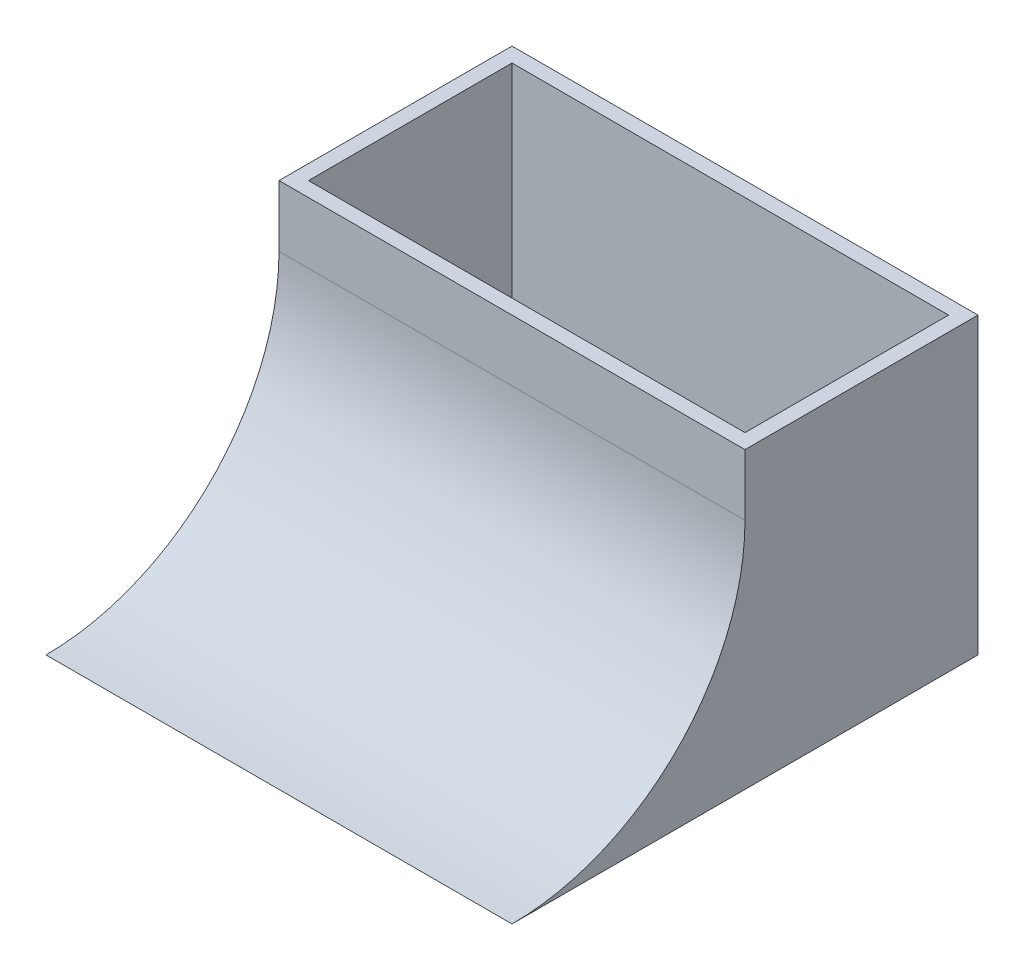
ISO-10303-21;
HEADER;
FILE_DESCRIPTION(('STEP AP214'),'2;1');
FILE_NAME('part.step','',(''),(''),'','','');
FILE_SCHEMA(('AUTOMOTIVE_DESIGN { 1 0 10303 214 1 1 1 1 }'));
ENDSEC;
DATA;
#1=APPLICATION_CONTEXT('core data for automotive mechanical design processes');
#2=APPLICATION_PROTOCOL_DEFINITION('international standard','automotive_design',2000,#1);
#3=PRODUCT_CONTEXT('',#1,'mechanical');
#4=PRODUCT('Part','Part','',(#3));
#5=PRODUCT_RELATED_PRODUCT_CATEGORY('part','',(#4));
#6=PRODUCT_DEFINITION_FORMATION('','',#4);
#7=PRODUCT_DEFINITION_CONTEXT('part definition',#1,'design');
#8=PRODUCT_DEFINITION('design','',#6,#7);
#9=PRODUCT_DEFINITION_SHAPE('','',#8);
#10=(LENGTH_UNIT() NAMED_UNIT(*) SI_UNIT(.MILLI.,.METRE.));
#11=(NAMED_UNIT(*) PLANE_ANGLE_UNIT() SI_UNIT($,.RADIAN.));
#12=(NAMED_UNIT(*) SI_UNIT($,.STERADIAN.) SOLID_ANGLE_UNIT());
#13=UNCERTAINTY_MEASURE_WITH_UNIT(LENGTH_MEASURE(1.E-05),#10,'distance_accuracy_value','');
#14=(GEOMETRIC_REPRESENTATION_CONTEXT(3) GLOBAL_UNCERTAINTY_ASSIGNED_CONTEXT((#13)) GLOBAL_UNIT_ASSIGNED_CONTEXT((#10,
#11,#12)) REPRESENTATION_CONTEXT('',''));
#15=CARTESIAN_POINT('',(0.,0.,0.));
#16=DIRECTION('',(0.,0.,1.));
#17=DIRECTION('',(1.,0.,0.));
#18=AXIS2_PLACEMENT_3D('',#15,#16,#17);
#19=CARTESIAN_POINT('',(47.5,-47.5,-47.5));
#20=DIRECTION('',(0.,1.,0.));
#21=DIRECTION('',(0.,0.,1.));
#22=AXIS2_PLACEMENT_3D('',#19,#20,#21);
#23=PLANE('',#22);
#24=DIRECTION('',(0.,0.,-1.));
#25=VECTOR('',#24,1.);
#26=CARTESIAN_POINT('',(-47.5,-47.5,-47.5));
#27=LINE('',#26,#25);
#28=CARTESIAN_POINT('',(-47.5,-47.5,47.5));
#29=VERTEX_POINT('',#28);
#30=CARTESIAN_POINT('',(-47.5,-47.5,-47.5));
#31=VERTEX_POINT('',#30);
#32=EDGE_CURVE('E168',#29,#31,#27,.T.);
#33=ORIENTED_EDGE('',*,*,#32,.T.);
#34=DIRECTION('',(-1.,0.,0.));
#35=VECTOR('',#34,1.);
#36=CARTESIAN_POINT('',(47.5,-47.5,-47.5));
#37=LINE('',#36,#35);
#38=CARTESIAN_POINT('',(47.5,-47.5,-47.5));
#39=VERTEX_POINT('',#38);
#40=EDGE_CURVE('E166',#39,#31,#37,.T.);
#41=ORIENTED_EDGE('',*,*,#40,.F.);
#42=DIRECTION('',(0.,0.,-1.));
#43=VECTOR('',#42,1.);
#44=CARTESIAN_POINT('',(47.5,-47.5,-47.5));
#45=LINE('',#44,#43);
#46=CARTESIAN_POINT('',(47.5,-47.5,47.5));
#47=VERTEX_POINT('',#46);
#48=EDGE_CURVE('E167',#47,#39,#45,.T.);
#49=ORIENTED_EDGE('',*,*,#48,.F.);
#50=DIRECTION('',(-1.,0.,0.));
#51=VECTOR('',#50,1.);
#52=CARTESIAN_POINT('',(47.5,-47.5,47.5));
#53=LINE('',#52,#51);
#54=EDGE_CURVE('E46',#47,#29,#53,.T.);
#55=ORIENTED_EDGE('',*,*,#54,.T.);
#56=EDGE_LOOP('',(#33,#41,#49,#55));
#57=FACE_BOUND('',#56,.T.);
#58=ADVANCED_FACE('F38',(#57),#23,.F.);
#59=CARTESIAN_POINT('',(47.5,47.5,-47.5));
#60=DIRECTION('',(0.,0.,1.));
#61=DIRECTION('',(0.,-1.,0.));
#62=AXIS2_PLACEMENT_3D('',#59,#60,#61);
#63=PLANE('',#62);
#64=DIRECTION('',(0.,1.,0.));
#65=VECTOR('',#64,1.);
#66=CARTESIAN_POINT('',(-47.5,47.5,-47.5));
#67=LINE('',#66,#65);
#68=CARTESIAN_POINT('',(-47.5,12.5,-47.5));
#69=VERTEX_POINT('',#68);
#70=EDGE_CURVE('E170',#31,#69,#67,.T.);
#71=ORIENTED_EDGE('',*,*,#70,.T.);
#72=DIRECTION('',(1.,0.,0.));
#73=VECTOR('',#72,1.);
#74=CARTESIAN_POINT('',(-47.5,12.5,-47.5));
#75=LINE('',#74,#73);
#76=CARTESIAN_POINT('',(47.5,12.5,-47.5));
#77=VERTEX_POINT('',#76);
#78=EDGE_CURVE('E151',#69,#77,#75,.T.);
#79=ORIENTED_EDGE('',*,*,#78,.T.);
#80=DIRECTION('',(0.,1.,0.));
#81=VECTOR('',#80,1.);
#82=CARTESIAN_POINT('',(47.5,47.5,-47.5));
#83=LINE('',#82,#81);
#84=EDGE_CURVE('E163',#39,#77,#83,.T.);
#85=ORIENTED_EDGE('',*,*,#84,.F.);
#86=ORIENTED_EDGE('',*,*,#40,.T.);
#87=EDGE_LOOP('',(#71,#79,#85,#86));
#88=FACE_BOUND('',#87,.T.);
#89=ADVANCED_FACE('F196',(#88),#63,.F.);
#90=CARTESIAN_POINT('',(47.5,0.,0.));
#91=DIRECTION('',(-1.,0.,0.));
#92=DIRECTION('',(0.,0.,1.));
#93=AXIS2_PLACEMENT_3D('',#90,#91,#92);
#94=PLANE('',#93);
#95=ORIENTED_EDGE('',*,*,#84,.T.);
#96=DIRECTION('',(0.,0.,-1.));
#97=VECTOR('',#96,1.);
#98=CARTESIAN_POINT('',(47.5,12.5,0.));
#99=LINE('',#98,#97);
#100=CARTESIAN_POINT('',(47.5,12.5,0.));
#101=VERTEX_POINT('',#100);
#102=EDGE_CURVE('E144',#101,#77,#99,.T.);
#103=ORIENTED_EDGE('',*,*,#102,.F.);
#104=DIRECTION('',(0.,1.,0.));
#105=VECTOR('',#104,1.);
#106=CARTESIAN_POINT('',(47.5,0.,0.));
#107=LINE('',#106,#105);
#108=CARTESIAN_POINT('',(47.5,0.,0.));
#109=VERTEX_POINT('',#108);
#110=EDGE_CURVE('E154',#109,#101,#107,.T.);
#111=ORIENTED_EDGE('',*,*,#110,.F.);
#112=CARTESIAN_POINT('',(47.5,0.,47.5));
#113=DIRECTION('',(1.,0.,0.));
#114=DIRECTION('',(0.,0.,-1.));
#115=AXIS2_PLACEMENT_3D('',#112,#113,#114);
#116=CIRCLE('',#115,47.5);
#117=EDGE_CURVE('E41',#47,#109,#116,.T.);
#118=ORIENTED_EDGE('',*,*,#117,.F.);
#119=ORIENTED_EDGE('',*,*,#48,.T.);
#120=EDGE_LOOP('',(#95,#103,#111,#118,#119));
#121=FACE_BOUND('',#120,.T.);
#122=ADVANCED_FACE('F188',(#121),#94,.F.);
#123=CARTESIAN_POINT('',(-47.5,0.,0.));
#124=DIRECTION('',(-1.,0.,0.));
#125=DIRECTION('',(0.,0.,1.));
#126=AXIS2_PLACEMENT_3D('',#123,#124,#125);
#127=PLANE('',#126);
#128=DIRECTION('',(0.,0.,-1.));
#129=VECTOR('',#128,1.);
#130=CARTESIAN_POINT('',(-47.5,12.5,0.));
#131=LINE('',#130,#129);
#132=CARTESIAN_POINT('',(-47.5,12.5,0.));
#133=VERTEX_POINT('',#132);
#134=EDGE_CURVE('E62',#133,#69,#131,.T.);
#135=ORIENTED_EDGE('',*,*,#134,.T.);
#136=ORIENTED_EDGE('',*,*,#70,.F.);
#137=ORIENTED_EDGE('',*,*,#32,.F.);
#138=CARTESIAN_POINT('',(-47.5,0.,47.5));
#139=DIRECTION('',(-1.,0.,0.));
#140=DIRECTION('',(0.,0.,1.));
#141=AXIS2_PLACEMENT_3D('',#138,#139,#140);
#142=CIRCLE('',#141,47.5);
#143=CARTESIAN_POINT('',(-47.5,0.,0.));
#144=VERTEX_POINT('',#143);
#145=EDGE_CURVE('E11',#144,#29,#142,.T.);
#146=ORIENTED_EDGE('',*,*,#145,.F.);
#147=DIRECTION('',(0.,1.,0.));
#148=VECTOR('',#147,1.);
#149=CARTESIAN_POINT('',(-47.5,0.,0.));
#150=LINE('',#149,#148);
#151=EDGE_CURVE('E158',#144,#133,#150,.T.);
#152=ORIENTED_EDGE('',*,*,#151,.T.);
#153=EDGE_LOOP('',(#135,#136,#137,#146,#152));
#154=FACE_BOUND('',#153,.T.);
#155=ADVANCED_FACE('F193',(#154),#127,.T.);
#156=CARTESIAN_POINT('',(-47.5,0.,47.5));
#157=DIRECTION('',(1.,0.,0.));
#158=DIRECTION('',(0.,0.,-1.));
#159=AXIS2_PLACEMENT_3D('',#156,#157,#158);
#160=CYLINDRICAL_SURFACE('',#159,47.5);
#161=ORIENTED_EDGE('',*,*,#117,.T.);
#162=DIRECTION('',(1.,0.,0.));
#163=VECTOR('',#162,1.);
#164=CARTESIAN_POINT('',(-47.5,0.,0.));
#165=LINE('',#164,#163);
#166=EDGE_CURVE('E161',#144,#109,#165,.T.);
#167=ORIENTED_EDGE('',*,*,#166,.F.);
#168=ORIENTED_EDGE('',*,*,#145,.T.);
#169=ORIENTED_EDGE('',*,*,#54,.F.);
#170=EDGE_LOOP('',(#161,#167,#168,#169));
#171=FACE_BOUND('',#170,.T.);
#172=ADVANCED_FACE('F183',(#171),#160,.F.);
#173=CARTESIAN_POINT('',(-47.5,0.,0.));
#174=DIRECTION('',(0.,0.,-1.));
#175=DIRECTION('',(0.,1.,0.));
#176=AXIS2_PLACEMENT_3D('',#173,#174,#175);
#177=PLANE('',#176);
#178=ORIENTED_EDGE('',*,*,#110,.T.);
#179=DIRECTION('',(1.,0.,0.));
#180=VECTOR('',#179,1.);
#181=CARTESIAN_POINT('',(-47.5,12.5,0.));
#182=LINE('',#181,#180);
#183=EDGE_CURVE('E150',#133,#101,#182,.T.);
#184=ORIENTED_EDGE('',*,*,#183,.F.);
#185=ORIENTED_EDGE('',*,*,#151,.F.);
#186=ORIENTED_EDGE('',*,*,#166,.T.);
#187=EDGE_LOOP('',(#178,#184,#185,#186));
#188=FACE_BOUND('',#187,.T.);
#189=ADVANCED_FACE('F191',(#188),#177,.F.);
#190=CARTESIAN_POINT('',(-47.5,12.5,0.));
#191=DIRECTION('',(0.,-1.,0.));
#192=DIRECTION('',(0.,0.,-1.));
#193=AXIS2_PLACEMENT_3D('',#190,#191,#192);
#194=PLANE('',#193);
#195=DIRECTION('',(-1.,0.,0.));
#196=VECTOR('',#195,1.);
#197=CARTESIAN_POINT('',(-44.5,12.5,-44.5));
#198=LINE('',#197,#196);
#199=CARTESIAN_POINT('',(44.5,12.5,-44.5));
#200=VERTEX_POINT('',#199);
#201=CARTESIAN_POINT('',(-44.5,12.5,-44.5));
#202=VERTEX_POINT('',#201);
#203=EDGE_CURVE('E138',#200,#202,#198,.T.);
#204=ORIENTED_EDGE('',*,*,#203,.F.);
#205=DIRECTION('',(0.,0.,-1.));
#206=VECTOR('',#205,1.);
#207=CARTESIAN_POINT('',(44.5,12.5,-3.));
#208=LINE('',#207,#206);
#209=CARTESIAN_POINT('',(44.5,12.5,-3.));
#210=VERTEX_POINT('',#209);
#211=EDGE_CURVE('E54',#210,#200,#208,.T.);
#212=ORIENTED_EDGE('',*,*,#211,.F.);
#213=DIRECTION('',(1.,0.,0.));
#214=VECTOR('',#213,1.);
#215=CARTESIAN_POINT('',(-44.5,12.5,-3.));
#216=LINE('',#215,#214);
#217=CARTESIAN_POINT('',(-44.5,12.5,-3.));
#218=VERTEX_POINT('',#217);
#219=EDGE_CURVE('E129',#218,#210,#216,.T.);
#220=ORIENTED_EDGE('',*,*,#219,.F.);
#221=DIRECTION('',(0.,0.,1.));
#222=VECTOR('',#221,1.);
#223=CARTESIAN_POINT('',(-44.5,12.5,-3.));
#224=LINE('',#223,#222);
#225=EDGE_CURVE('E132',#202,#218,#224,.T.);
#226=ORIENTED_EDGE('',*,*,#225,.F.);
#227=EDGE_LOOP('',(#204,#212,#220,#226));
#228=FACE_BOUND('',#227,.T.);
#229=ORIENTED_EDGE('',*,*,#78,.F.);
#230=ORIENTED_EDGE('',*,*,#134,.F.);
#231=ORIENTED_EDGE('',*,*,#183,.T.);
#232=ORIENTED_EDGE('',*,*,#102,.T.);
#233=EDGE_LOOP('',(#229,#230,#231,#232));
#234=FACE_BOUND('',#233,.T.);
#235=ADVANCED_FACE('F198',(#228,#234),#194,.F.);
#236=CARTESIAN_POINT('',(44.5,-44.5,-3.));
#237=DIRECTION('',(1.,0.,0.));
#238=DIRECTION('',(0.,0.,-1.));
#239=AXIS2_PLACEMENT_3D('',#236,#237,#238);
#240=PLANE('',#239);
#241=ORIENTED_EDGE('',*,*,#211,.T.);
#242=DIRECTION('',(0.,1.,0.));
#243=VECTOR('',#242,1.);
#244=CARTESIAN_POINT('',(44.5,-44.5,-44.5));
#245=LINE('',#244,#243);
#246=CARTESIAN_POINT('',(44.5,-44.5,-44.5));
#247=VERTEX_POINT('',#246);
#248=EDGE_CURVE('E107',#247,#200,#245,.T.);
#249=ORIENTED_EDGE('',*,*,#248,.F.);
#250=DIRECTION('',(0.,0.,-1.));
#251=VECTOR('',#250,1.);
#252=CARTESIAN_POINT('',(44.5,-44.5,-3.));
#253=LINE('',#252,#251);
#254=CARTESIAN_POINT('',(44.5,-44.5,-3.));
#255=VERTEX_POINT('',#254);
#256=EDGE_CURVE('E111',#255,#247,#253,.T.);
#257=ORIENTED_EDGE('',*,*,#256,.F.);
#258=DIRECTION('',(0.,1.,0.));
#259=VECTOR('',#258,1.);
#260=CARTESIAN_POINT('',(44.5,-44.5,-3.));
#261=LINE('',#260,#259);
#262=EDGE_CURVE('E142',#255,#210,#261,.T.);
#263=ORIENTED_EDGE('',*,*,#262,.T.);
#264=EDGE_LOOP('',(#241,#249,#257,#263));
#265=FACE_BOUND('',#264,.T.);
#266=ADVANCED_FACE('F109',(#265),#240,.F.);
#267=CARTESIAN_POINT('',(-44.5,-44.5,-3.));
#268=DIRECTION('',(0.,0.,1.));
#269=DIRECTION('',(1.,0.,0.));
#270=AXIS2_PLACEMENT_3D('',#267,#268,#269);
#271=PLANE('',#270);
#272=ORIENTED_EDGE('',*,*,#219,.T.);
#273=ORIENTED_EDGE('',*,*,#262,.F.);
#274=DIRECTION('',(1.,0.,0.));
#275=VECTOR('',#274,1.);
#276=CARTESIAN_POINT('',(-44.5,-44.5,-3.));
#277=LINE('',#276,#275);
#278=CARTESIAN_POINT('',(-44.5,-44.5,-3.));
#279=VERTEX_POINT('',#278);
#280=EDGE_CURVE('E117',#279,#255,#277,.T.);
#281=ORIENTED_EDGE('',*,*,#280,.F.);
#282=DIRECTION('',(0.,1.,0.));
#283=VECTOR('',#282,1.);
#284=CARTESIAN_POINT('',(-44.5,-44.5,-3.));
#285=LINE('',#284,#283);
#286=EDGE_CURVE('E145',#279,#218,#285,.T.);
#287=ORIENTED_EDGE('',*,*,#286,.T.);
#288=EDGE_LOOP('',(#272,#273,#281,#287));
#289=FACE_BOUND('',#288,.T.);
#290=ADVANCED_FACE('F207',(#289),#271,.F.);
#291=CARTESIAN_POINT('',(-44.5,-44.5,-3.));
#292=DIRECTION('',(-1.,0.,0.));
#293=DIRECTION('',(0.,0.,1.));
#294=AXIS2_PLACEMENT_3D('',#291,#292,#293);
#295=PLANE('',#294);
#296=ORIENTED_EDGE('',*,*,#225,.T.);
#297=ORIENTED_EDGE('',*,*,#286,.F.);
#298=DIRECTION('',(0.,0.,1.));
#299=VECTOR('',#298,1.);
#300=CARTESIAN_POINT('',(-44.5,-44.5,-3.));
#301=LINE('',#300,#299);
#302=CARTESIAN_POINT('',(-44.5,-44.5,-44.5));
#303=VERTEX_POINT('',#302);
#304=EDGE_CURVE('E125',#303,#279,#301,.T.);
#305=ORIENTED_EDGE('',*,*,#304,.F.);
#306=DIRECTION('',(0.,1.,0.));
#307=VECTOR('',#306,1.);
#308=CARTESIAN_POINT('',(-44.5,-44.5,-44.5));
#309=LINE('',#308,#307);
#310=EDGE_CURVE('E116',#303,#202,#309,.T.);
#311=ORIENTED_EDGE('',*,*,#310,.T.);
#312=EDGE_LOOP('',(#296,#297,#305,#311));
#313=FACE_BOUND('',#312,.T.);
#314=ADVANCED_FACE('F243',(#313),#295,.F.);
#315=CARTESIAN_POINT('',(-44.5,-44.5,-44.5));
#316=DIRECTION('',(0.,0.,-1.));
#317=DIRECTION('',(-1.,0.,0.));
#318=AXIS2_PLACEMENT_3D('',#315,#316,#317);
#319=PLANE('',#318);
#320=ORIENTED_EDGE('',*,*,#203,.T.);
#321=ORIENTED_EDGE('',*,*,#310,.F.);
#322=DIRECTION('',(-1.,0.,0.));
#323=VECTOR('',#322,1.);
#324=CARTESIAN_POINT('',(-44.5,-44.5,-44.5));
#325=LINE('',#324,#323);
#326=EDGE_CURVE('E120',#247,#303,#325,.T.);
#327=ORIENTED_EDGE('',*,*,#326,.F.);
#328=ORIENTED_EDGE('',*,*,#248,.T.);
#329=EDGE_LOOP('',(#320,#321,#327,#328));
#330=FACE_BOUND('',#329,.T.);
#331=ADVANCED_FACE('F121',(#330),#319,.F.);
#332=CARTESIAN_POINT('',(0.,-44.5,0.));
#333=DIRECTION('',(0.,-1.,0.));
#334=DIRECTION('',(0.,0.,-1.));
#335=AXIS2_PLACEMENT_3D('',#332,#333,#334);
#336=PLANE('',#335);
#337=ORIENTED_EDGE('',*,*,#256,.T.);
#338=ORIENTED_EDGE('',*,*,#326,.T.);
#339=ORIENTED_EDGE('',*,*,#304,.T.);
#340=ORIENTED_EDGE('',*,*,#280,.T.);
#341=EDGE_LOOP('',(#337,#338,#339,#340));
#342=FACE_BOUND('',#341,.T.);
#343=ADVANCED_FACE('F127',(#342),#336,.F.);
#344=CLOSED_SHELL('',(#58,#89,#122,#155,#172,#189,#235,#266,#290,#314,#331,#343));
#345=MANIFOLD_SOLID_BREP('B2',#344);
#346=ADVANCED_BREP_SHAPE_REPRESENTATION('',(#18,#345),#14);
#347=SHAPE_DEFINITION_REPRESENTATION(#9,#346);
ENDSEC;
END-ISO-10303-21;
